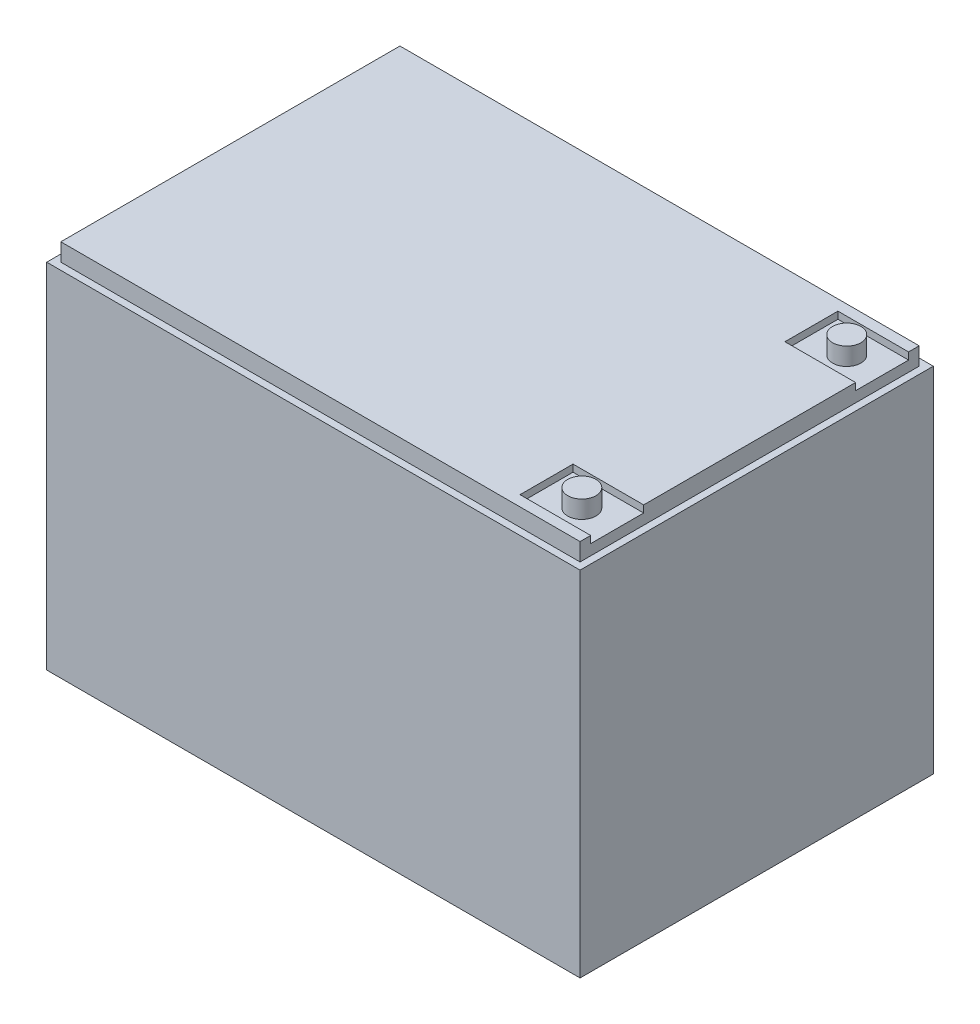
ISO-10303-21;
HEADER;
FILE_DESCRIPTION(('STEP AP214'),'2;1');
FILE_NAME('part.step','',(''),(''),'','','');
FILE_SCHEMA(('AUTOMOTIVE_DESIGN { 1 0 10303 214 1 1 1 1 }'));
ENDSEC;
DATA;
#1=APPLICATION_CONTEXT('core data for automotive mechanical design processes');
#2=APPLICATION_PROTOCOL_DEFINITION('international standard','automotive_design',2000,#1);
#3=PRODUCT_CONTEXT('',#1,'mechanical');
#4=PRODUCT('Part','Part','',(#3));
#5=PRODUCT_RELATED_PRODUCT_CATEGORY('part','',(#4));
#6=PRODUCT_DEFINITION_FORMATION('','',#4);
#7=PRODUCT_DEFINITION_CONTEXT('part definition',#1,'design');
#8=PRODUCT_DEFINITION('design','',#6,#7);
#9=PRODUCT_DEFINITION_SHAPE('','',#8);
#10=(LENGTH_UNIT() NAMED_UNIT(*) SI_UNIT(.MILLI.,.METRE.));
#11=(NAMED_UNIT(*) PLANE_ANGLE_UNIT() SI_UNIT($,.RADIAN.));
#12=(NAMED_UNIT(*) SI_UNIT($,.STERADIAN.) SOLID_ANGLE_UNIT());
#13=UNCERTAINTY_MEASURE_WITH_UNIT(LENGTH_MEASURE(1.E-05),#10,'distance_accuracy_value','');
#14=(GEOMETRIC_REPRESENTATION_CONTEXT(3) GLOBAL_UNCERTAINTY_ASSIGNED_CONTEXT((#13)) GLOBAL_UNIT_ASSIGNED_CONTEXT((#10,
#11,#12)) REPRESENTATION_CONTEXT('',''));
#15=CARTESIAN_POINT('',(0.,0.,0.));
#16=DIRECTION('',(0.,0.,1.));
#17=DIRECTION('',(1.,0.,0.));
#18=AXIS2_PLACEMENT_3D('',#15,#16,#17);
#19=CARTESIAN_POINT('',(75.5,105.,50.));
#20=DIRECTION('',(-1.,0.,0.));
#21=DIRECTION('',(0.,0.,1.));
#22=AXIS2_PLACEMENT_3D('',#19,#20,#21);
#23=PLANE('',#22);
#24=DIRECTION('',(0.,0.,-1.));
#25=VECTOR('',#24,1.);
#26=CARTESIAN_POINT('',(75.5,100.,50.));
#27=LINE('',#26,#25);
#28=CARTESIAN_POINT('',(75.5,100.,50.));
#29=VERTEX_POINT('',#28);
#30=CARTESIAN_POINT('',(75.5,100.,-50.));
#31=VERTEX_POINT('',#30);
#32=EDGE_CURVE('E275',#29,#31,#27,.T.);
#33=ORIENTED_EDGE('',*,*,#32,.F.);
#34=DIRECTION('',(0.,-1.,0.));
#35=VECTOR('',#34,1.);
#36=CARTESIAN_POINT('',(75.5,105.,50.));
#37=LINE('',#36,#35);
#38=CARTESIAN_POINT('',(75.5,0.,50.));
#39=VERTEX_POINT('',#38);
#40=EDGE_CURVE('E300',#29,#39,#37,.T.);
#41=ORIENTED_EDGE('',*,*,#40,.T.);
#42=DIRECTION('',(0.,0.,-1.));
#43=VECTOR('',#42,1.);
#44=CARTESIAN_POINT('',(75.5,0.,50.));
#45=LINE('',#44,#43);
#46=CARTESIAN_POINT('',(75.5,0.,-50.));
#47=VERTEX_POINT('',#46);
#48=EDGE_CURVE('E284',#39,#47,#45,.T.);
#49=ORIENTED_EDGE('',*,*,#48,.T.);
#50=DIRECTION('',(0.,-1.,0.));
#51=VECTOR('',#50,1.);
#52=CARTESIAN_POINT('',(75.5,105.,-50.));
#53=LINE('',#52,#51);
#54=EDGE_CURVE('E47',#31,#47,#53,.T.);
#55=ORIENTED_EDGE('',*,*,#54,.F.);
#56=EDGE_LOOP('',(#33,#41,#49,#55));
#57=FACE_BOUND('',#56,.T.);
#58=ADVANCED_FACE('F39',(#57),#23,.F.);
#59=CARTESIAN_POINT('',(-75.5,105.,-50.));
#60=DIRECTION('',(0.,0.,1.));
#61=DIRECTION('',(1.,0.,0.));
#62=AXIS2_PLACEMENT_3D('',#59,#60,#61);
#63=PLANE('',#62);
#64=DIRECTION('',(-1.,0.,0.));
#65=VECTOR('',#64,1.);
#66=CARTESIAN_POINT('',(75.5,100.,-50.));
#67=LINE('',#66,#65);
#68=CARTESIAN_POINT('',(-75.5,100.,-50.));
#69=VERTEX_POINT('',#68);
#70=EDGE_CURVE('E278',#31,#69,#67,.T.);
#71=ORIENTED_EDGE('',*,*,#70,.F.);
#72=ORIENTED_EDGE('',*,*,#54,.T.);
#73=DIRECTION('',(-1.,0.,0.));
#74=VECTOR('',#73,1.);
#75=CARTESIAN_POINT('',(-75.5,0.,-50.));
#76=LINE('',#75,#74);
#77=CARTESIAN_POINT('',(-75.5,0.,-50.));
#78=VERTEX_POINT('',#77);
#79=EDGE_CURVE('E288',#47,#78,#76,.T.);
#80=ORIENTED_EDGE('',*,*,#79,.T.);
#81=DIRECTION('',(0.,-1.,0.));
#82=VECTOR('',#81,1.);
#83=CARTESIAN_POINT('',(-75.5,105.,-50.));
#84=LINE('',#83,#82);
#85=EDGE_CURVE('E306',#69,#78,#84,.T.);
#86=ORIENTED_EDGE('',*,*,#85,.F.);
#87=EDGE_LOOP('',(#71,#72,#80,#86));
#88=FACE_BOUND('',#87,.T.);
#89=ADVANCED_FACE('F313',(#88),#63,.F.);
#90=CARTESIAN_POINT('',(-75.5,105.,50.));
#91=DIRECTION('',(1.,0.,0.));
#92=DIRECTION('',(0.,0.,-1.));
#93=AXIS2_PLACEMENT_3D('',#90,#91,#92);
#94=PLANE('',#93);
#95=DIRECTION('',(0.,0.,1.));
#96=VECTOR('',#95,1.);
#97=CARTESIAN_POINT('',(-75.5,100.,-50.));
#98=LINE('',#97,#96);
#99=CARTESIAN_POINT('',(-75.5,100.,50.));
#100=VERTEX_POINT('',#99);
#101=EDGE_CURVE('E281',#69,#100,#98,.T.);
#102=ORIENTED_EDGE('',*,*,#101,.F.);
#103=ORIENTED_EDGE('',*,*,#85,.T.);
#104=DIRECTION('',(0.,0.,1.));
#105=VECTOR('',#104,1.);
#106=CARTESIAN_POINT('',(-75.5,0.,50.));
#107=LINE('',#106,#105);
#108=CARTESIAN_POINT('',(-75.5,0.,50.));
#109=VERTEX_POINT('',#108);
#110=EDGE_CURVE('E292',#78,#109,#107,.T.);
#111=ORIENTED_EDGE('',*,*,#110,.T.);
#112=DIRECTION('',(0.,-1.,0.));
#113=VECTOR('',#112,1.);
#114=CARTESIAN_POINT('',(-75.5,105.,50.));
#115=LINE('',#114,#113);
#116=EDGE_CURVE('E303',#100,#109,#115,.T.);
#117=ORIENTED_EDGE('',*,*,#116,.F.);
#118=EDGE_LOOP('',(#102,#103,#111,#117));
#119=FACE_BOUND('',#118,.T.);
#120=ADVANCED_FACE('F329',(#119),#94,.F.);
#121=CARTESIAN_POINT('',(-75.5,105.,50.));
#122=DIRECTION('',(0.,0.,-1.));
#123=DIRECTION('',(-1.,0.,0.));
#124=AXIS2_PLACEMENT_3D('',#121,#122,#123);
#125=PLANE('',#124);
#126=DIRECTION('',(1.,0.,0.));
#127=VECTOR('',#126,1.);
#128=CARTESIAN_POINT('',(-75.5,100.,50.));
#129=LINE('',#128,#127);
#130=EDGE_CURVE('E263',#100,#29,#129,.T.);
#131=ORIENTED_EDGE('',*,*,#130,.F.);
#132=ORIENTED_EDGE('',*,*,#116,.T.);
#133=DIRECTION('',(1.,0.,0.));
#134=VECTOR('',#133,1.);
#135=CARTESIAN_POINT('',(-75.5,0.,50.));
#136=LINE('',#135,#134);
#137=EDGE_CURVE('E296',#109,#39,#136,.T.);
#138=ORIENTED_EDGE('',*,*,#137,.T.);
#139=ORIENTED_EDGE('',*,*,#40,.F.);
#140=EDGE_LOOP('',(#131,#132,#138,#139));
#141=FACE_BOUND('',#140,.T.);
#142=ADVANCED_FACE('F325',(#141),#125,.F.);
#143=CARTESIAN_POINT('',(0.,0.,0.));
#144=DIRECTION('',(0.,-1.,0.));
#145=DIRECTION('',(0.,0.,-1.));
#146=AXIS2_PLACEMENT_3D('',#143,#144,#145);
#147=PLANE('',#146);
#148=ORIENTED_EDGE('',*,*,#48,.F.);
#149=ORIENTED_EDGE('',*,*,#137,.F.);
#150=ORIENTED_EDGE('',*,*,#110,.F.);
#151=ORIENTED_EDGE('',*,*,#79,.F.);
#152=EDGE_LOOP('',(#148,#149,#150,#151));
#153=FACE_BOUND('',#152,.T.);
#154=ADVANCED_FACE('F320',(#153),#147,.T.);
#155=CARTESIAN_POINT('',(0.,100.,0.));
#156=DIRECTION('',(0.,1.,0.));
#157=DIRECTION('',(0.,0.,1.));
#158=AXIS2_PLACEMENT_3D('',#155,#156,#157);
#159=PLANE('',#158);
#160=DIRECTION('',(1.,0.,0.));
#161=VECTOR('',#160,1.);
#162=CARTESIAN_POINT('',(-73.5,100.,48.));
#163=LINE('',#162,#161);
#164=CARTESIAN_POINT('',(-73.5,100.,48.));
#165=VERTEX_POINT('',#164);
#166=CARTESIAN_POINT('',(73.5,100.,48.));
#167=VERTEX_POINT('',#166);
#168=EDGE_CURVE('E239',#165,#167,#163,.T.);
#169=ORIENTED_EDGE('',*,*,#168,.F.);
#170=DIRECTION('',(0.,0.,1.));
#171=VECTOR('',#170,1.);
#172=CARTESIAN_POINT('',(-73.5,100.,-48.));
#173=LINE('',#172,#171);
#174=CARTESIAN_POINT('',(-73.5,100.,-48.));
#175=VERTEX_POINT('',#174);
#176=EDGE_CURVE('E235',#175,#165,#173,.T.);
#177=ORIENTED_EDGE('',*,*,#176,.F.);
#178=DIRECTION('',(-1.,0.,0.));
#179=VECTOR('',#178,1.);
#180=CARTESIAN_POINT('',(73.5,100.,-48.));
#181=LINE('',#180,#179);
#182=CARTESIAN_POINT('',(73.5,100.,-48.));
#183=VERTEX_POINT('',#182);
#184=EDGE_CURVE('E230',#183,#175,#181,.T.);
#185=ORIENTED_EDGE('',*,*,#184,.F.);
#186=DIRECTION('',(0.,0.,-1.));
#187=VECTOR('',#186,1.);
#188=CARTESIAN_POINT('',(73.5,100.,48.));
#189=LINE('',#188,#187);
#190=EDGE_CURVE('E226',#167,#183,#189,.T.);
#191=ORIENTED_EDGE('',*,*,#190,.F.);
#192=EDGE_LOOP('',(#169,#177,#185,#191));
#193=FACE_BOUND('',#192,.T.);
#194=ORIENTED_EDGE('',*,*,#130,.T.);
#195=ORIENTED_EDGE('',*,*,#32,.T.);
#196=ORIENTED_EDGE('',*,*,#70,.T.);
#197=ORIENTED_EDGE('',*,*,#101,.T.);
#198=EDGE_LOOP('',(#194,#195,#196,#197));
#199=FACE_BOUND('',#198,.T.);
#200=ADVANCED_FACE('F331',(#193,#199),#159,.T.);
#201=CARTESIAN_POINT('',(73.5,100.,48.));
#202=DIRECTION('',(1.,0.,0.));
#203=DIRECTION('',(0.,0.,-1.));
#204=AXIS2_PLACEMENT_3D('',#201,#202,#203);
#205=PLANE('',#204);
#206=DIRECTION('',(0.,1.,0.));
#207=VECTOR('',#206,1.);
#208=CARTESIAN_POINT('',(73.5,103.,-30.));
#209=LINE('',#208,#207);
#210=CARTESIAN_POINT('',(73.5,103.,-30.));
#211=VERTEX_POINT('',#210);
#212=CARTESIAN_POINT('',(73.5,105.,-30.));
#213=VERTEX_POINT('',#212);
#214=EDGE_CURVE('E376',#211,#213,#209,.T.);
#215=ORIENTED_EDGE('',*,*,#214,.T.);
#216=DIRECTION('',(0.,0.,-1.));
#217=VECTOR('',#216,1.);
#218=CARTESIAN_POINT('',(73.5,105.,48.));
#219=LINE('',#218,#217);
#220=CARTESIAN_POINT('',(73.5,105.,30.));
#221=VERTEX_POINT('',#220);
#222=EDGE_CURVE('E249',#221,#213,#219,.T.);
#223=ORIENTED_EDGE('',*,*,#222,.F.);
#224=DIRECTION('',(0.,1.,0.));
#225=VECTOR('',#224,1.);
#226=CARTESIAN_POINT('',(73.5,103.,30.));
#227=LINE('',#226,#225);
#228=CARTESIAN_POINT('',(73.5,103.,30.));
#229=VERTEX_POINT('',#228);
#230=EDGE_CURVE('E62',#229,#221,#227,.T.);
#231=ORIENTED_EDGE('',*,*,#230,.F.);
#232=DIRECTION('',(0.,0.,-1.));
#233=VECTOR('',#232,1.);
#234=CARTESIAN_POINT('',(73.5,103.,45.));
#235=LINE('',#234,#233);
#236=CARTESIAN_POINT('',(73.5,103.,45.));
#237=VERTEX_POINT('',#236);
#238=EDGE_CURVE('E186',#237,#229,#235,.T.);
#239=ORIENTED_EDGE('',*,*,#238,.F.);
#240=DIRECTION('',(0.,1.,0.));
#241=VECTOR('',#240,1.);
#242=CARTESIAN_POINT('',(73.5,103.,45.));
#243=LINE('',#242,#241);
#244=CARTESIAN_POINT('',(73.5,105.,45.));
#245=VERTEX_POINT('',#244);
#246=EDGE_CURVE('E213',#237,#245,#243,.T.);
#247=ORIENTED_EDGE('',*,*,#246,.T.);
#248=CARTESIAN_POINT('',(73.5,105.,48.));
#249=VERTEX_POINT('',#248);
#250=EDGE_CURVE('E244',#249,#245,#219,.T.);
#251=ORIENTED_EDGE('',*,*,#250,.F.);
#252=DIRECTION('',(0.,1.,0.));
#253=VECTOR('',#252,1.);
#254=CARTESIAN_POINT('',(73.5,100.,48.));
#255=LINE('',#254,#253);
#256=EDGE_CURVE('E260',#167,#249,#255,.T.);
#257=ORIENTED_EDGE('',*,*,#256,.F.);
#258=ORIENTED_EDGE('',*,*,#190,.T.);
#259=DIRECTION('',(0.,1.,0.));
#260=VECTOR('',#259,1.);
#261=CARTESIAN_POINT('',(73.5,100.,-48.));
#262=LINE('',#261,#260);
#263=CARTESIAN_POINT('',(73.5,105.,-48.));
#264=VERTEX_POINT('',#263);
#265=EDGE_CURVE('E243',#183,#264,#262,.T.);
#266=ORIENTED_EDGE('',*,*,#265,.T.);
#267=CARTESIAN_POINT('',(73.5,105.,-45.));
#268=VERTEX_POINT('',#267);
#269=EDGE_CURVE('E176',#268,#264,#219,.T.);
#270=ORIENTED_EDGE('',*,*,#269,.F.);
#271=DIRECTION('',(0.,1.,0.));
#272=VECTOR('',#271,1.);
#273=CARTESIAN_POINT('',(73.5,103.,-45.));
#274=LINE('',#273,#272);
#275=CARTESIAN_POINT('',(73.5,103.,-45.));
#276=VERTEX_POINT('',#275);
#277=EDGE_CURVE('E54',#276,#268,#274,.T.);
#278=ORIENTED_EDGE('',*,*,#277,.F.);
#279=DIRECTION('',(0.,0.,-1.));
#280=VECTOR('',#279,1.);
#281=CARTESIAN_POINT('',(73.5,103.,-45.));
#282=LINE('',#281,#280);
#283=EDGE_CURVE('E161',#211,#276,#282,.T.);
#284=ORIENTED_EDGE('',*,*,#283,.F.);
#285=EDGE_LOOP('',(#215,#223,#231,#239,#247,#251,#257,#258,#266,#270,#278,#284));
#286=FACE_BOUND('',#285,.T.);
#287=ADVANCED_FACE('F174',(#286),#205,.T.);
#288=CARTESIAN_POINT('',(-73.5,100.,48.));
#289=DIRECTION('',(0.,0.,1.));
#290=DIRECTION('',(1.,0.,0.));
#291=AXIS2_PLACEMENT_3D('',#288,#289,#290);
#292=PLANE('',#291);
#293=DIRECTION('',(1.,0.,0.));
#294=VECTOR('',#293,1.);
#295=CARTESIAN_POINT('',(-73.5,105.,48.));
#296=LINE('',#295,#294);
#297=CARTESIAN_POINT('',(-73.5,105.,48.));
#298=VERTEX_POINT('',#297);
#299=EDGE_CURVE('E231',#298,#249,#296,.T.);
#300=ORIENTED_EDGE('',*,*,#299,.F.);
#301=DIRECTION('',(0.,1.,0.));
#302=VECTOR('',#301,1.);
#303=CARTESIAN_POINT('',(-73.5,100.,48.));
#304=LINE('',#303,#302);
#305=EDGE_CURVE('E264',#165,#298,#304,.T.);
#306=ORIENTED_EDGE('',*,*,#305,.F.);
#307=ORIENTED_EDGE('',*,*,#168,.T.);
#308=ORIENTED_EDGE('',*,*,#256,.T.);
#309=EDGE_LOOP('',(#300,#306,#307,#308));
#310=FACE_BOUND('',#309,.T.);
#311=ADVANCED_FACE('F339',(#310),#292,.T.);
#312=CARTESIAN_POINT('',(-73.5,100.,-48.));
#313=DIRECTION('',(-1.,0.,0.));
#314=DIRECTION('',(0.,0.,1.));
#315=AXIS2_PLACEMENT_3D('',#312,#313,#314);
#316=PLANE('',#315);
#317=DIRECTION('',(0.,0.,1.));
#318=VECTOR('',#317,1.);
#319=CARTESIAN_POINT('',(-73.5,105.,-48.));
#320=LINE('',#319,#318);
#321=CARTESIAN_POINT('',(-73.5,105.,-48.));
#322=VERTEX_POINT('',#321);
#323=EDGE_CURVE('E253',#322,#298,#320,.T.);
#324=ORIENTED_EDGE('',*,*,#323,.F.);
#325=DIRECTION('',(0.,1.,0.));
#326=VECTOR('',#325,1.);
#327=CARTESIAN_POINT('',(-73.5,100.,-48.));
#328=LINE('',#327,#326);
#329=EDGE_CURVE('E267',#175,#322,#328,.T.);
#330=ORIENTED_EDGE('',*,*,#329,.F.);
#331=ORIENTED_EDGE('',*,*,#176,.T.);
#332=ORIENTED_EDGE('',*,*,#305,.T.);
#333=EDGE_LOOP('',(#324,#330,#331,#332));
#334=FACE_BOUND('',#333,.T.);
#335=ADVANCED_FACE('F366',(#334),#316,.T.);
#336=CARTESIAN_POINT('',(73.5,100.,-48.));
#337=DIRECTION('',(0.,0.,-1.));
#338=DIRECTION('',(-1.,0.,0.));
#339=AXIS2_PLACEMENT_3D('',#336,#337,#338);
#340=PLANE('',#339);
#341=DIRECTION('',(-1.,0.,0.));
#342=VECTOR('',#341,1.);
#343=CARTESIAN_POINT('',(73.5,105.,-48.));
#344=LINE('',#343,#342);
#345=EDGE_CURVE('E248',#264,#322,#344,.T.);
#346=ORIENTED_EDGE('',*,*,#345,.F.);
#347=ORIENTED_EDGE('',*,*,#265,.F.);
#348=ORIENTED_EDGE('',*,*,#184,.T.);
#349=ORIENTED_EDGE('',*,*,#329,.T.);
#350=EDGE_LOOP('',(#346,#347,#348,#349));
#351=FACE_BOUND('',#350,.T.);
#352=ADVANCED_FACE('F357',(#351),#340,.T.);
#353=CARTESIAN_POINT('',(0.,105.,0.));
#354=DIRECTION('',(0.,-1.,0.));
#355=DIRECTION('',(0.,0.,-1.));
#356=AXIS2_PLACEMENT_3D('',#353,#354,#355);
#357=PLANE('',#356);
#358=ORIENTED_EDGE('',*,*,#222,.T.);
#359=DIRECTION('',(1.,0.,0.));
#360=VECTOR('',#359,1.);
#361=CARTESIAN_POINT('',(73.5,105.,-30.));
#362=LINE('',#361,#360);
#363=CARTESIAN_POINT('',(53.5,105.,-30.));
#364=VERTEX_POINT('',#363);
#365=EDGE_CURVE('E171',#364,#213,#362,.T.);
#366=ORIENTED_EDGE('',*,*,#365,.F.);
#367=DIRECTION('',(0.,0.,1.));
#368=VECTOR('',#367,1.);
#369=CARTESIAN_POINT('',(53.5,105.,-45.));
#370=LINE('',#369,#368);
#371=CARTESIAN_POINT('',(53.5,105.,-45.));
#372=VERTEX_POINT('',#371);
#373=EDGE_CURVE('E383',#372,#364,#370,.T.);
#374=ORIENTED_EDGE('',*,*,#373,.F.);
#375=DIRECTION('',(-1.,0.,0.));
#376=VECTOR('',#375,1.);
#377=CARTESIAN_POINT('',(73.5,105.,-45.));
#378=LINE('',#377,#376);
#379=EDGE_CURVE('E217',#268,#372,#378,.T.);
#380=ORIENTED_EDGE('',*,*,#379,.F.);
#381=ORIENTED_EDGE('',*,*,#269,.T.);
#382=ORIENTED_EDGE('',*,*,#345,.T.);
#383=ORIENTED_EDGE('',*,*,#323,.T.);
#384=ORIENTED_EDGE('',*,*,#299,.T.);
#385=ORIENTED_EDGE('',*,*,#250,.T.);
#386=DIRECTION('',(1.,0.,0.));
#387=VECTOR('',#386,1.);
#388=CARTESIAN_POINT('',(73.5,105.,45.));
#389=LINE('',#388,#387);
#390=CARTESIAN_POINT('',(53.5,105.,45.));
#391=VERTEX_POINT('',#390);
#392=EDGE_CURVE('E191',#391,#245,#389,.T.);
#393=ORIENTED_EDGE('',*,*,#392,.F.);
#394=DIRECTION('',(0.,0.,1.));
#395=VECTOR('',#394,1.);
#396=CARTESIAN_POINT('',(53.5,105.,45.));
#397=LINE('',#396,#395);
#398=CARTESIAN_POINT('',(53.5,105.,30.));
#399=VERTEX_POINT('',#398);
#400=EDGE_CURVE('E206',#399,#391,#397,.T.);
#401=ORIENTED_EDGE('',*,*,#400,.F.);
#402=DIRECTION('',(-1.,0.,0.));
#403=VECTOR('',#402,1.);
#404=CARTESIAN_POINT('',(73.5,105.,30.));
#405=LINE('',#404,#403);
#406=EDGE_CURVE('E203',#221,#399,#405,.T.);
#407=ORIENTED_EDGE('',*,*,#406,.F.);
#408=EDGE_LOOP('',(#358,#366,#374,#380,#381,#382,#383,#384,#385,#393,#401,#407));
#409=FACE_BOUND('',#408,.T.);
#410=ADVANCED_FACE('F354',(#409),#357,.F.);
#411=CARTESIAN_POINT('',(73.5,103.,45.));
#412=DIRECTION('',(0.,0.,1.));
#413=DIRECTION('',(1.,0.,0.));
#414=AXIS2_PLACEMENT_3D('',#411,#412,#413);
#415=PLANE('',#414);
#416=ORIENTED_EDGE('',*,*,#392,.T.);
#417=ORIENTED_EDGE('',*,*,#246,.F.);
#418=DIRECTION('',(1.,0.,0.));
#419=VECTOR('',#418,1.);
#420=CARTESIAN_POINT('',(73.5,103.,45.));
#421=LINE('',#420,#419);
#422=CARTESIAN_POINT('',(53.5,103.,45.));
#423=VERTEX_POINT('',#422);
#424=EDGE_CURVE('E199',#423,#237,#421,.T.);
#425=ORIENTED_EDGE('',*,*,#424,.F.);
#426=DIRECTION('',(0.,1.,0.));
#427=VECTOR('',#426,1.);
#428=CARTESIAN_POINT('',(53.5,103.,45.));
#429=LINE('',#428,#427);
#430=EDGE_CURVE('E218',#423,#391,#429,.T.);
#431=ORIENTED_EDGE('',*,*,#430,.T.);
#432=EDGE_LOOP('',(#416,#417,#425,#431));
#433=FACE_BOUND('',#432,.T.);
#434=ADVANCED_FACE('F356',(#433),#415,.F.);
#435=CARTESIAN_POINT('',(53.5,103.,45.));
#436=DIRECTION('',(-1.,0.,0.));
#437=DIRECTION('',(0.,0.,1.));
#438=AXIS2_PLACEMENT_3D('',#435,#436,#437);
#439=PLANE('',#438);
#440=ORIENTED_EDGE('',*,*,#400,.T.);
#441=ORIENTED_EDGE('',*,*,#430,.F.);
#442=DIRECTION('',(0.,0.,1.));
#443=VECTOR('',#442,1.);
#444=CARTESIAN_POINT('',(53.5,103.,45.));
#445=LINE('',#444,#443);
#446=CARTESIAN_POINT('',(53.5,103.,30.));
#447=VERTEX_POINT('',#446);
#448=EDGE_CURVE('E195',#447,#423,#445,.T.);
#449=ORIENTED_EDGE('',*,*,#448,.F.);
#450=DIRECTION('',(0.,1.,0.));
#451=VECTOR('',#450,1.);
#452=CARTESIAN_POINT('',(53.5,103.,30.));
#453=LINE('',#452,#451);
#454=EDGE_CURVE('E221',#447,#399,#453,.T.);
#455=ORIENTED_EDGE('',*,*,#454,.T.);
#456=EDGE_LOOP('',(#440,#441,#449,#455));
#457=FACE_BOUND('',#456,.T.);
#458=ADVANCED_FACE('F363',(#457),#439,.F.);
#459=CARTESIAN_POINT('',(73.5,103.,30.));
#460=DIRECTION('',(0.,0.,-1.));
#461=DIRECTION('',(-1.,0.,0.));
#462=AXIS2_PLACEMENT_3D('',#459,#460,#461);
#463=PLANE('',#462);
#464=ORIENTED_EDGE('',*,*,#406,.T.);
#465=ORIENTED_EDGE('',*,*,#454,.F.);
#466=DIRECTION('',(-1.,0.,0.));
#467=VECTOR('',#466,1.);
#468=CARTESIAN_POINT('',(73.5,103.,30.));
#469=LINE('',#468,#467);
#470=EDGE_CURVE('E190',#229,#447,#469,.T.);
#471=ORIENTED_EDGE('',*,*,#470,.F.);
#472=ORIENTED_EDGE('',*,*,#230,.T.);
#473=EDGE_LOOP('',(#464,#465,#471,#472));
#474=FACE_BOUND('',#473,.T.);
#475=ADVANCED_FACE('F434',(#474),#463,.F.);
#476=CARTESIAN_POINT('',(0.,103.,0.));
#477=DIRECTION('',(0.,1.,0.));
#478=DIRECTION('',(0.,0.,1.));
#479=AXIS2_PLACEMENT_3D('',#476,#477,#478);
#480=PLANE('',#479);
#481=CARTESIAN_POINT('',(63.5,103.,37.5));
#482=DIRECTION('',(0.,1.,0.));
#483=DIRECTION('',(0.,0.,1.));
#484=AXIS2_PLACEMENT_3D('',#481,#482,#483);
#485=CIRCLE('',#484,4.00000000000001);
#486=CARTESIAN_POINT('',(63.5,103.,41.5));
#487=VERTEX_POINT('',#486);
#488=EDGE_CURVE('E391',#487,#487,#485,.T.);
#489=ORIENTED_EDGE('',*,*,#488,.F.);
#490=EDGE_LOOP('',(#489));
#491=FACE_BOUND('',#490,.T.);
#492=ORIENTED_EDGE('',*,*,#238,.T.);
#493=ORIENTED_EDGE('',*,*,#470,.T.);
#494=ORIENTED_EDGE('',*,*,#448,.T.);
#495=ORIENTED_EDGE('',*,*,#424,.T.);
#496=EDGE_LOOP('',(#492,#493,#494,#495));
#497=FACE_BOUND('',#496,.T.);
#498=ADVANCED_FACE('F428',(#491,#497),#480,.T.);
#499=CARTESIAN_POINT('',(73.5,103.,-30.));
#500=DIRECTION('',(0.,0.,1.));
#501=DIRECTION('',(1.,0.,0.));
#502=AXIS2_PLACEMENT_3D('',#499,#500,#501);
#503=PLANE('',#502);
#504=ORIENTED_EDGE('',*,*,#365,.T.);
#505=ORIENTED_EDGE('',*,*,#214,.F.);
#506=DIRECTION('',(1.,0.,0.));
#507=VECTOR('',#506,1.);
#508=CARTESIAN_POINT('',(73.5,103.,-30.));
#509=LINE('',#508,#507);
#510=CARTESIAN_POINT('',(53.5,103.,-30.));
#511=VERTEX_POINT('',#510);
#512=EDGE_CURVE('E167',#511,#211,#509,.T.);
#513=ORIENTED_EDGE('',*,*,#512,.F.);
#514=DIRECTION('',(0.,1.,0.));
#515=VECTOR('',#514,1.);
#516=CARTESIAN_POINT('',(53.5,103.,-30.));
#517=LINE('',#516,#515);
#518=EDGE_CURVE('E181',#511,#364,#517,.T.);
#519=ORIENTED_EDGE('',*,*,#518,.T.);
#520=EDGE_LOOP('',(#504,#505,#513,#519));
#521=FACE_BOUND('',#520,.T.);
#522=ADVANCED_FACE('F425',(#521),#503,.F.);
#523=CARTESIAN_POINT('',(53.5,103.,-45.));
#524=DIRECTION('',(-1.,0.,0.));
#525=DIRECTION('',(0.,0.,1.));
#526=AXIS2_PLACEMENT_3D('',#523,#524,#525);
#527=PLANE('',#526);
#528=ORIENTED_EDGE('',*,*,#373,.T.);
#529=ORIENTED_EDGE('',*,*,#518,.F.);
#530=DIRECTION('',(0.,0.,1.));
#531=VECTOR('',#530,1.);
#532=CARTESIAN_POINT('',(53.5,103.,-45.));
#533=LINE('',#532,#531);
#534=CARTESIAN_POINT('',(53.5,103.,-45.));
#535=VERTEX_POINT('',#534);
#536=EDGE_CURVE('E160',#535,#511,#533,.T.);
#537=ORIENTED_EDGE('',*,*,#536,.F.);
#538=DIRECTION('',(0.,1.,0.));
#539=VECTOR('',#538,1.);
#540=CARTESIAN_POINT('',(53.5,103.,-45.));
#541=LINE('',#540,#539);
#542=EDGE_CURVE('E155',#535,#372,#541,.T.);
#543=ORIENTED_EDGE('',*,*,#542,.T.);
#544=EDGE_LOOP('',(#528,#529,#537,#543));
#545=FACE_BOUND('',#544,.T.);
#546=ADVANCED_FACE('F421',(#545),#527,.F.);
#547=CARTESIAN_POINT('',(73.5,103.,-45.));
#548=DIRECTION('',(0.,0.,-1.));
#549=DIRECTION('',(-1.,0.,0.));
#550=AXIS2_PLACEMENT_3D('',#547,#548,#549);
#551=PLANE('',#550);
#552=ORIENTED_EDGE('',*,*,#379,.T.);
#553=ORIENTED_EDGE('',*,*,#542,.F.);
#554=DIRECTION('',(-1.,0.,0.));
#555=VECTOR('',#554,1.);
#556=CARTESIAN_POINT('',(73.5,103.,-45.));
#557=LINE('',#556,#555);
#558=EDGE_CURVE('E152',#276,#535,#557,.T.);
#559=ORIENTED_EDGE('',*,*,#558,.F.);
#560=ORIENTED_EDGE('',*,*,#277,.T.);
#561=EDGE_LOOP('',(#552,#553,#559,#560));
#562=FACE_BOUND('',#561,.T.);
#563=ADVANCED_FACE('F154',(#562),#551,.F.);
#564=CARTESIAN_POINT('',(0.,103.,0.));
#565=DIRECTION('',(0.,-1.,0.));
#566=DIRECTION('',(0.,0.,-1.));
#567=AXIS2_PLACEMENT_3D('',#564,#565,#566);
#568=PLANE('',#567);
#569=CARTESIAN_POINT('',(63.5,103.,-37.5));
#570=DIRECTION('',(0.,-1.,0.));
#571=DIRECTION('',(0.,0.,-1.));
#572=AXIS2_PLACEMENT_3D('',#569,#570,#571);
#573=CIRCLE('',#572,4.00000000000001);
#574=CARTESIAN_POINT('',(63.5,103.,-41.5));
#575=VERTEX_POINT('',#574);
#576=EDGE_CURVE('E11',#575,#575,#573,.F.);
#577=ORIENTED_EDGE('',*,*,#576,.F.);
#578=EDGE_LOOP('',(#577));
#579=FACE_BOUND('',#578,.T.);
#580=ORIENTED_EDGE('',*,*,#283,.T.);
#581=ORIENTED_EDGE('',*,*,#558,.T.);
#582=ORIENTED_EDGE('',*,*,#536,.T.);
#583=ORIENTED_EDGE('',*,*,#512,.T.);
#584=EDGE_LOOP('',(#580,#581,#582,#583));
#585=FACE_BOUND('',#584,.T.);
#586=ADVANCED_FACE('F165',(#579,#585),#568,.F.);
#587=CARTESIAN_POINT('',(63.5,108.,37.5));
#588=DIRECTION('',(0.,-1.,0.));
#589=DIRECTION('',(0.,0.,-1.));
#590=AXIS2_PLACEMENT_3D('',#587,#588,#589);
#591=CYLINDRICAL_SURFACE('',#590,4.00000000000001);
#592=CARTESIAN_POINT('',(63.5,108.,37.5));
#593=DIRECTION('',(0.,1.,0.));
#594=DIRECTION('',(0.,0.,1.));
#595=AXIS2_PLACEMENT_3D('',#592,#593,#594);
#596=CIRCLE('',#595,4.00000000000001);
#597=CARTESIAN_POINT('',(63.5,108.,41.5));
#598=VERTEX_POINT('',#597);
#599=EDGE_CURVE('E207',#598,#598,#596,.T.);
#600=ORIENTED_EDGE('',*,*,#599,.F.);
#601=EDGE_LOOP('',(#600));
#602=FACE_BOUND('',#601,.T.);
#603=ORIENTED_EDGE('',*,*,#488,.T.);
#604=EDGE_LOOP('',(#603));
#605=FACE_BOUND('',#604,.T.);
#606=ADVANCED_FACE('F413',(#602,#605),#591,.T.);
#607=CARTESIAN_POINT('',(63.5,108.,37.5));
#608=DIRECTION('',(0.,1.,0.));
#609=DIRECTION('',(0.,0.,1.));
#610=AXIS2_PLACEMENT_3D('',#607,#608,#609);
#611=PLANE('',#610);
#612=ORIENTED_EDGE('',*,*,#599,.T.);
#613=EDGE_LOOP('',(#612));
#614=FACE_BOUND('',#613,.T.);
#615=ADVANCED_FACE('F408',(#614),#611,.T.);
#616=CARTESIAN_POINT('',(63.5,108.,-37.5));
#617=DIRECTION('',(0.,-1.,0.));
#618=DIRECTION('',(0.,0.,-1.));
#619=AXIS2_PLACEMENT_3D('',#616,#617,#618);
#620=CYLINDRICAL_SURFACE('',#619,4.00000000000001);
#621=CARTESIAN_POINT('',(63.5,108.,-37.5));
#622=DIRECTION('',(0.,1.,0.));
#623=DIRECTION('',(0.,0.,-1.));
#624=AXIS2_PLACEMENT_3D('',#621,#622,#623);
#625=CIRCLE('',#624,4.00000000000001);
#626=CARTESIAN_POINT('',(63.5,108.,-41.5));
#627=VERTEX_POINT('',#626);
#628=EDGE_CURVE('E395',#627,#627,#625,.T.);
#629=ORIENTED_EDGE('',*,*,#628,.F.);
#630=EDGE_LOOP('',(#629));
#631=FACE_BOUND('',#630,.T.);
#632=ORIENTED_EDGE('',*,*,#576,.T.);
#633=EDGE_LOOP('',(#632));
#634=FACE_BOUND('',#633,.T.);
#635=ADVANCED_FACE('F405',(#631,#634),#620,.T.);
#636=CARTESIAN_POINT('',(63.5,108.,-37.5));
#637=DIRECTION('',(0.,-1.,0.));
#638=DIRECTION('',(0.,0.,-1.));
#639=AXIS2_PLACEMENT_3D('',#636,#637,#638);
#640=PLANE('',#639);
#641=ORIENTED_EDGE('',*,*,#628,.T.);
#642=EDGE_LOOP('',(#641));
#643=FACE_BOUND('',#642,.T.);
#644=ADVANCED_FACE('F403',(#643),#640,.F.);
#645=CLOSED_SHELL('',(#58,#89,#120,#142,#154,#200,#287,#311,#335,#352,#410,#434,#458,#475,#498,
#522,#546,#563,#586,#606,#615,#635,#644));
#646=MANIFOLD_SOLID_BREP('B2',#645);
#647=ADVANCED_BREP_SHAPE_REPRESENTATION('',(#18,#646),#14);
#648=SHAPE_DEFINITION_REPRESENTATION(#9,#647);
ENDSEC;
END-ISO-10303-21;
